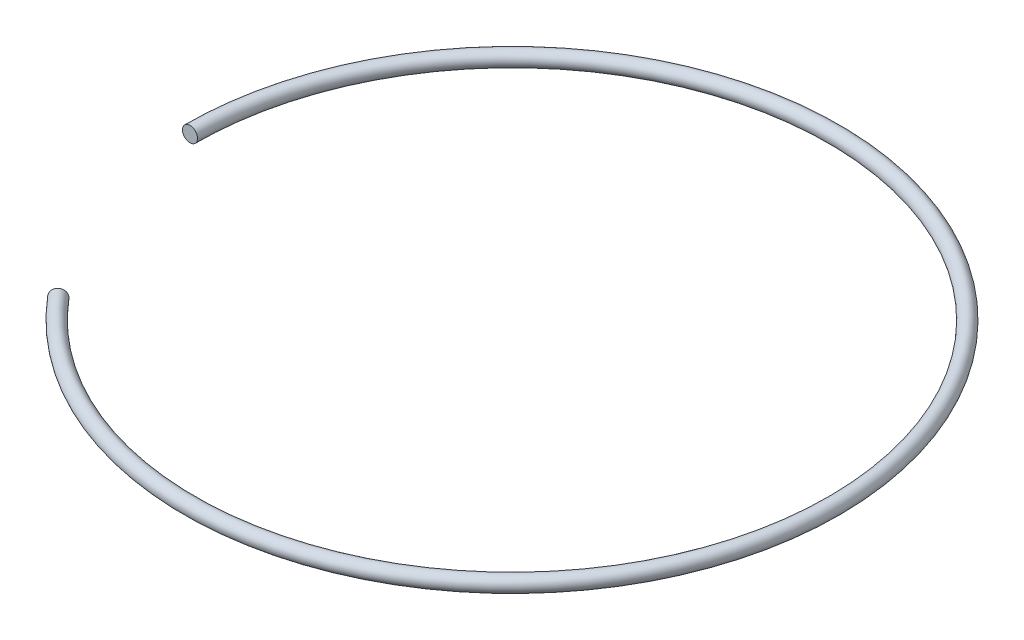
ISO-10303-21;
HEADER;
FILE_DESCRIPTION(('STEP AP214'),'2;1');
FILE_NAME('part.step','',(''),(''),'','','');
FILE_SCHEMA(('AUTOMOTIVE_DESIGN { 1 0 10303 214 1 1 1 1 }'));
ENDSEC;
DATA;
#1=APPLICATION_CONTEXT('core data for automotive mechanical design processes');
#2=APPLICATION_PROTOCOL_DEFINITION('international standard','automotive_design',2000,#1);
#3=PRODUCT_CONTEXT('',#1,'mechanical');
#4=PRODUCT('Part','Part','',(#3));
#5=PRODUCT_RELATED_PRODUCT_CATEGORY('part','',(#4));
#6=PRODUCT_DEFINITION_FORMATION('','',#4);
#7=PRODUCT_DEFINITION_CONTEXT('part definition',#1,'design');
#8=PRODUCT_DEFINITION('design','',#6,#7);
#9=PRODUCT_DEFINITION_SHAPE('','',#8);
#10=(LENGTH_UNIT() NAMED_UNIT(*) SI_UNIT(.MILLI.,.METRE.));
#11=(NAMED_UNIT(*) PLANE_ANGLE_UNIT() SI_UNIT($,.RADIAN.));
#12=(NAMED_UNIT(*) SI_UNIT($,.STERADIAN.) SOLID_ANGLE_UNIT());
#13=UNCERTAINTY_MEASURE_WITH_UNIT(LENGTH_MEASURE(1.E-05),#10,'distance_accuracy_value','');
#14=(GEOMETRIC_REPRESENTATION_CONTEXT(3) GLOBAL_UNCERTAINTY_ASSIGNED_CONTEXT((#13)) GLOBAL_UNIT_ASSIGNED_CONTEXT((#10,
#11,#12)) REPRESENTATION_CONTEXT('',''));
#15=CARTESIAN_POINT('',(0.,0.,0.));
#16=DIRECTION('',(0.,0.,1.));
#17=DIRECTION('',(1.,0.,0.));
#18=AXIS2_PLACEMENT_3D('',#15,#16,#17);
#19=CARTESIAN_POINT('',(0.,0.,0.));
#20=DIRECTION('',(0.64278760968653,0.,0.766044443118986));
#21=DIRECTION('',(0.766044443118986,0.,-0.64278760968653));
#22=AXIS2_PLACEMENT_3D('',#19,#20,#21);
#23=PLANE('',#22);
#24=CARTESIAN_POINT('',(-4.78777776949366,4.56,4.01742256054081));
#25=CARTESIAN_POINT('',(-4.78778591241968,4.57680750835501,4.01742939326704));
#26=CARTESIAN_POINT('',(-4.78998044190497,4.59371844128932,4.01927082214875));
#27=CARTESIAN_POINT('',(-4.79852995207161,4.62558323599696,4.02644471297632));
#28=CARTESIAN_POINT('',(-4.80488493275295,4.64053709777029,4.03177717492218));
#29=CARTESIAN_POINT('',(-4.82102946456407,4.66687074596776,4.04532404561041));
#30=CARTESIAN_POINT('',(-4.83081901569392,4.6782505323918,4.05353845435287));
#31=CARTESIAN_POINT('',(-4.85273151567716,4.6961346650492,4.07192522500697));
#32=CARTESIAN_POINT('',(-4.86485446453054,4.70263901128258,4.08209758691862));
#33=CARTESIAN_POINT('',(-4.8900662947074,4.71004353855515,4.10325282432133));
#34=CARTESIAN_POINT('',(-4.90315517603088,4.71094371959435,4.11423569981238));
#35=CARTESIAN_POINT('',(-4.92882345309191,4.70703844536533,4.13577394162726));
#36=CARTESIAN_POINT('',(-4.94140284882947,4.70223299009711,4.14632930795108));
#37=CARTESIAN_POINT('',(-4.96463360190911,4.68745356130633,4.16582222429217));
#38=CARTESIAN_POINT('',(-4.97528495925119,4.67747958778377,4.17475977430945));
#39=CARTESIAN_POINT('',(-4.99345980723178,4.65350623717002,4.19001028254666));
#40=CARTESIAN_POINT('',(-5.00098329787028,4.63950686007882,4.19632324076659));
#41=CARTESIAN_POINT('',(-5.01205039157567,4.60899118714948,4.20560963501299));
#42=CARTESIAN_POINT('',(-5.01559399464255,4.59247489131134,4.20858307103945));
#43=CARTESIAN_POINT('',(-5.01738149297963,4.57052398291492,4.21008296023482));
#44=CARTESIAN_POINT('',(-5.01759365422699,4.5652670698381,4.21026098465923));
#45=CARTESIAN_POINT('',(-5.01758295950333,4.54319249164499,4.21025201072055));
#46=CARTESIAN_POINT('',(-5.01538843001804,4.52628155871068,4.20841058183884));
#47=CARTESIAN_POINT('',(-5.00683891985141,4.49441676400304,4.20123669101127));
#48=CARTESIAN_POINT('',(-5.00048393917006,4.4794629022297,4.19590422906541));
#49=CARTESIAN_POINT('',(-4.98433940735895,4.45312925403224,4.18235735837718));
#50=CARTESIAN_POINT('',(-4.97454985622909,4.4417494676082,4.17414294963473));
#51=CARTESIAN_POINT('',(-4.95263735624586,4.42386533495079,4.15575617898062));
#52=CARTESIAN_POINT('',(-4.94051440739247,4.41736098871742,4.14558381706897));
#53=CARTESIAN_POINT('',(-4.91530257721561,4.40995646144485,4.12442857966626));
#54=CARTESIAN_POINT('',(-4.90221369589213,4.40905628040565,4.11344570417521));
#55=CARTESIAN_POINT('',(-4.8765454188311,4.41296155463467,4.09190746236033));
#56=CARTESIAN_POINT('',(-4.86396602309354,4.41776700990289,4.08135209603651));
#57=CARTESIAN_POINT('',(-4.8407352700139,4.43254643869367,4.06185917969542));
#58=CARTESIAN_POINT('',(-4.83008391267182,4.44252041221623,4.05292162967814));
#59=CARTESIAN_POINT('',(-4.81190906469123,4.46649376282998,4.03767112144093));
#60=CARTESIAN_POINT('',(-4.80438557405273,4.48049313992117,4.031358163221));
#61=CARTESIAN_POINT('',(-4.79331848034734,4.51100881285051,4.0220717689746));
#62=CARTESIAN_POINT('',(-4.78977487728046,4.52752510868866,4.01909833294815));
#63=CARTESIAN_POINT('',(-4.78798737894338,4.54947601708507,4.01759844375277));
#64=CARTESIAN_POINT('',(-4.78777521769602,4.5547329301619,4.01742041932836));
#65=CARTESIAN_POINT('',(-4.78777776949366,4.56,4.01742256054081));
#66=B_SPLINE_CURVE_WITH_KNOTS('',3,(#24,#25,#26,#27,#28,#29,#30,#31,#32,#33,#34,#35,#36,#37,#38,
#39,#40,#41,#42,#43,#44,#45,#46,#47,#48,#49,#50,#51,#52,#53,#54,#55,#56,#57,#58,#59,#60,#61,#62,
#63,#64,#65),.UNSPECIFIED.,.T.,.F.,(4,2,2,2,2,2,2,2,2,2,2,2,2,2,2,2,2,2,2,2,4),(0.,
0.0503657057955509,0.100731411591102,0.151097117387926,0.201462823184745,0.251828528981566,
0.302194234778389,0.352559940575213,0.402925646372034,0.453291352168856,0.469074755887429,
0.51944046168298,0.56980616747853,0.620171873275353,0.670537579072175,0.720903284868998,
0.771268990665819,0.821634696462641,0.872000402259462,0.922366108056283,0.938149511774859),.UNSPECIFIED.);
#67=CARTESIAN_POINT('',(-4.78777776949366,4.56,4.01742256054081));
#68=VERTEX_POINT('',#67);
#69=EDGE_CURVE('E18',#68,#68,#66,.T.);
#70=ORIENTED_EDGE('',*,*,#69,.F.);
#71=EDGE_LOOP('',(#70));
#72=FACE_BOUND('',#71,.T.);
#73=ADVANCED_FACE('F14',(#72),#23,.F.);
#74=CARTESIAN_POINT('',(0.,0.,0.));
#75=DIRECTION('',(0.,0.,1.));
#76=DIRECTION('',(1.,0.,0.));
#77=AXIS2_PLACEMENT_3D('',#74,#75,#76);
#78=PLANE('',#77);
#79=CARTESIAN_POINT('',(-6.55,4.56,0.));
#80=CARTESIAN_POINT('',(-6.54998937016501,4.57680750835501,0.));
#81=CARTESIAN_POINT('',(-6.54712461537826,4.59371844128932,0.));
#82=CARTESIAN_POINT('',(-6.53596402248651,4.62558323599696,0.));
#83=CARTESIAN_POINT('',(-6.52766818438152,4.64053709777029,0.));
#84=CARTESIAN_POINT('',(-6.50659299487243,4.66687074596776,0.));
#85=CARTESIAN_POINT('',(-6.49381364346823,4.67825053239179,0.));
#86=CARTESIAN_POINT('',(-6.46520890626262,4.6961346650492,0.));
#87=CARTESIAN_POINT('',(-6.44938352046122,4.70263901128258,0.));
#88=CARTESIAN_POINT('',(-6.41647181357094,4.71004353855515,0.));
#89=CARTESIAN_POINT('',(-6.39938549248206,4.71094371959435,0.));
#90=CARTESIAN_POINT('',(-6.36587793650198,4.70703844536533,0.));
#91=CARTESIAN_POINT('',(-6.34945670161078,4.70223299009711,0.));
#92=CARTESIAN_POINT('',(-6.31913110720394,4.68745356130633,0.));
#93=CARTESIAN_POINT('',(-6.30522674768831,4.67747958778377,0.));
#94=CARTESIAN_POINT('',(-6.28150116865195,4.65350623717002,0.));
#95=CARTESIAN_POINT('',(-6.27167994913122,4.63950686007882,0.));
#96=CARTESIAN_POINT('',(-6.25723288433648,4.60899118714949,0.));
#97=CARTESIAN_POINT('',(-6.25260703906248,4.59247489131134,0.));
#98=CARTESIAN_POINT('',(-6.25027362570358,4.57052398291492,0.));
#99=CARTESIAN_POINT('',(-6.24999666886477,4.5652670698381,0.));
#100=CARTESIAN_POINT('',(-6.25001062983499,4.54319249164499,0.));
#101=CARTESIAN_POINT('',(-6.25287538462174,4.52628155871068,0.));
#102=CARTESIAN_POINT('',(-6.26403597751348,4.49441676400304,0.));
#103=CARTESIAN_POINT('',(-6.27233181561848,4.4794629022297,0.));
#104=CARTESIAN_POINT('',(-6.29340700512756,4.45312925403224,0.));
#105=CARTESIAN_POINT('',(-6.30618635653177,4.4417494676082,0.));
#106=CARTESIAN_POINT('',(-6.33479109373738,4.42386533495079,0.));
#107=CARTESIAN_POINT('',(-6.35061647953878,4.41736098871742,0.));
#108=CARTESIAN_POINT('',(-6.38352818642906,4.40995646144485,0.));
#109=CARTESIAN_POINT('',(-6.40061450751794,4.40905628040565,0.));
#110=CARTESIAN_POINT('',(-6.43412206349802,4.41296155463467,0.));
#111=CARTESIAN_POINT('',(-6.45054329838922,4.41776700990289,0.));
#112=CARTESIAN_POINT('',(-6.48086889279606,4.43254643869367,0.));
#113=CARTESIAN_POINT('',(-6.49477325231169,4.44252041221623,0.));
#114=CARTESIAN_POINT('',(-6.51849883134805,4.46649376282998,0.));
#115=CARTESIAN_POINT('',(-6.52832005086878,4.48049313992117,0.));
#116=CARTESIAN_POINT('',(-6.54276711566352,4.51100881285051,0.));
#117=CARTESIAN_POINT('',(-6.54739296093752,4.52752510868866,0.));
#118=CARTESIAN_POINT('',(-6.54972637429642,4.54947601708507,0.));
#119=CARTESIAN_POINT('',(-6.55000333113523,4.5547329301619,0.));
#120=CARTESIAN_POINT('',(-6.55,4.56,0.));
#121=B_SPLINE_CURVE_WITH_KNOTS('',3,(#79,#80,#81,#82,#83,#84,#85,#86,#87,#88,#89,#90,#91,#92,
#93,#94,#95,#96,#97,#98,#99,#100,#101,#102,#103,#104,#105,#106,#107,#108,#109,#110,#111,#112,
#113,#114,#115,#116,#117,#118,#119,#120),.UNSPECIFIED.,.T.,.F.,(4,2,2,2,2,2,2,2,2,2,2,2,2,2,2,2,
2,2,2,2,4),(0.,0.0503657057955509,0.100731411591102,0.151097117387923,0.201462823184745,
0.251828528981567,0.302194234778389,0.35255994057521,0.402925646372032,0.453291352168854,
0.46907475588743,0.51944046168298,0.569806167478531,0.620171873275354,0.670537579072174,
0.720903284868996,0.771268990665818,0.821634696462639,0.872000402259462,0.922366108056283,
0.938149511774858),.UNSPECIFIED.);
#122=CARTESIAN_POINT('',(-6.55,4.56,0.));
#123=VERTEX_POINT('',#122);
#124=EDGE_CURVE('E10',#123,#123,#121,.T.);
#125=ORIENTED_EDGE('',*,*,#124,.F.);
#126=EDGE_LOOP('',(#125));
#127=FACE_BOUND('',#126,.T.);
#128=ADVANCED_FACE('F36',(#127),#78,.T.);
#129=CARTESIAN_POINT('',(0.,4.56,0.));
#130=DIRECTION('',(0.,1.,0.));
#131=DIRECTION('',(0.,0.,1.));
#132=AXIS2_PLACEMENT_3D('',#129,#130,#131);
#133=TOROIDAL_SURFACE('',#132,6.4,0.150000000000001);
#134=ORIENTED_EDGE('',*,*,#124,.T.);
#135=EDGE_LOOP('',(#134));
#136=FACE_BOUND('',#135,.T.);
#137=ORIENTED_EDGE('',*,*,#69,.T.);
#138=EDGE_LOOP('',(#137));
#139=FACE_BOUND('',#138,.T.);
#140=ADVANCED_FACE('F34',(#136,#139),#133,.T.);
#141=CLOSED_SHELL('',(#73,#128,#140));
#142=MANIFOLD_SOLID_BREP('B1',#141);
#143=ADVANCED_BREP_SHAPE_REPRESENTATION('',(#18,#142),#14);
#144=SHAPE_DEFINITION_REPRESENTATION(#9,#143);
ENDSEC;
END-ISO-10303-21;
